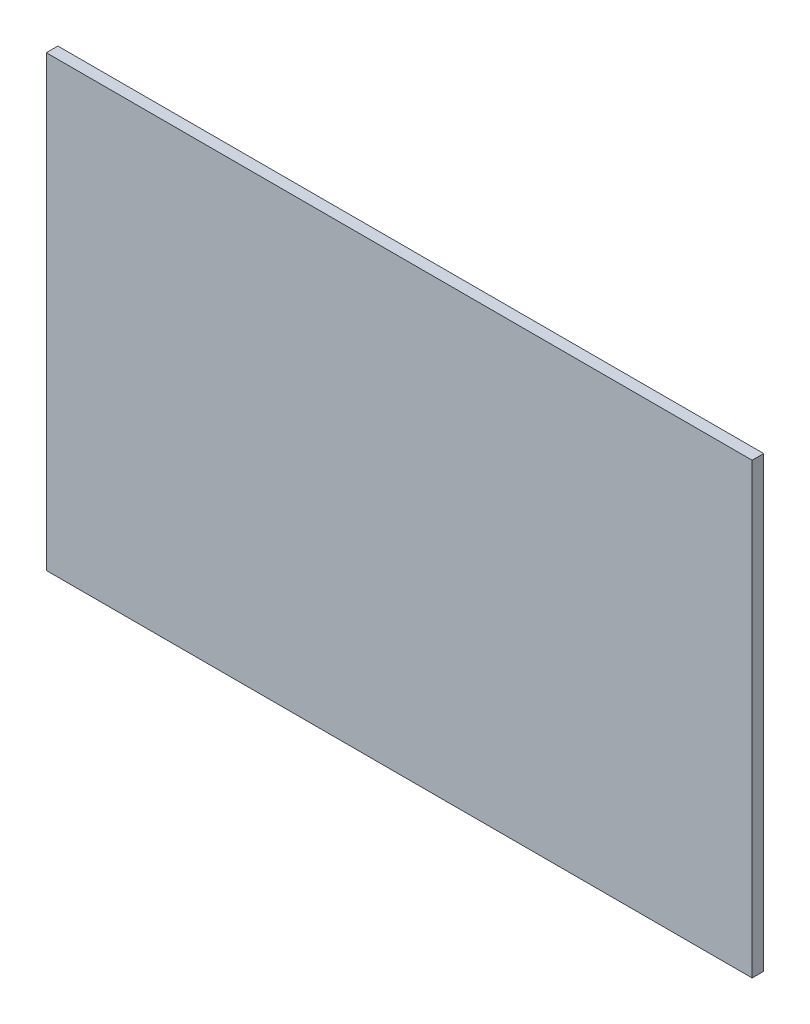
ISO-10303-21;
HEADER;
FILE_DESCRIPTION(('STEP AP214'),'2;1');
FILE_NAME('part.step','',(''),(''),'','','');
FILE_SCHEMA(('AUTOMOTIVE_DESIGN { 1 0 10303 214 1 1 1 1 }'));
ENDSEC;
DATA;
#1=APPLICATION_CONTEXT('core data for automotive mechanical design processes');
#2=APPLICATION_PROTOCOL_DEFINITION('international standard','automotive_design',2000,#1);
#3=PRODUCT_CONTEXT('',#1,'mechanical');
#4=PRODUCT('Part','Part','',(#3));
#5=PRODUCT_RELATED_PRODUCT_CATEGORY('part','',(#4));
#6=PRODUCT_DEFINITION_FORMATION('','',#4);
#7=PRODUCT_DEFINITION_CONTEXT('part definition',#1,'design');
#8=PRODUCT_DEFINITION('design','',#6,#7);
#9=PRODUCT_DEFINITION_SHAPE('','',#8);
#10=(LENGTH_UNIT() NAMED_UNIT(*) SI_UNIT(.MILLI.,.METRE.));
#11=(NAMED_UNIT(*) PLANE_ANGLE_UNIT() SI_UNIT($,.RADIAN.));
#12=(NAMED_UNIT(*) SI_UNIT($,.STERADIAN.) SOLID_ANGLE_UNIT());
#13=UNCERTAINTY_MEASURE_WITH_UNIT(LENGTH_MEASURE(1.E-05),#10,'distance_accuracy_value','');
#14=(GEOMETRIC_REPRESENTATION_CONTEXT(3) GLOBAL_UNCERTAINTY_ASSIGNED_CONTEXT((#13)) GLOBAL_UNIT_ASSIGNED_CONTEXT((#10,
#11,#12)) REPRESENTATION_CONTEXT('',''));
#15=CARTESIAN_POINT('',(0.,0.,0.));
#16=DIRECTION('',(0.,0.,1.));
#17=DIRECTION('',(1.,0.,0.));
#18=AXIS2_PLACEMENT_3D('',#15,#16,#17);
#19=CARTESIAN_POINT('',(0.,0.,40.));
#20=DIRECTION('',(1.,0.,0.));
#21=DIRECTION('',(0.,0.,-1.));
#22=AXIS2_PLACEMENT_3D('',#19,#20,#21);
#23=PLANE('',#22);
#24=DIRECTION('',(0.,-1.,0.));
#25=VECTOR('',#24,1.);
#26=CARTESIAN_POINT('',(0.,0.,0.));
#27=LINE('',#26,#25);
#28=CARTESIAN_POINT('',(0.,1550.,0.));
#29=VERTEX_POINT('',#28);
#30=CARTESIAN_POINT('',(0.,0.,0.));
#31=VERTEX_POINT('',#30);
#32=EDGE_CURVE('E99',#29,#31,#27,.T.);
#33=ORIENTED_EDGE('',*,*,#32,.T.);
#34=DIRECTION('',(0.,0.,-1.));
#35=VECTOR('',#34,1.);
#36=CARTESIAN_POINT('',(0.,0.,40.));
#37=LINE('',#36,#35);
#38=CARTESIAN_POINT('',(0.,0.,40.));
#39=VERTEX_POINT('',#38);
#40=EDGE_CURVE('E11',#39,#31,#37,.T.);
#41=ORIENTED_EDGE('',*,*,#40,.F.);
#42=DIRECTION('',(0.,-1.,0.));
#43=VECTOR('',#42,1.);
#44=CARTESIAN_POINT('',(0.,0.,40.));
#45=LINE('',#44,#43);
#46=CARTESIAN_POINT('',(0.,1550.,40.));
#47=VERTEX_POINT('',#46);
#48=EDGE_CURVE('E87',#47,#39,#45,.T.);
#49=ORIENTED_EDGE('',*,*,#48,.F.);
#50=DIRECTION('',(0.,0.,-1.));
#51=VECTOR('',#50,1.);
#52=CARTESIAN_POINT('',(0.,1550.,40.));
#53=LINE('',#52,#51);
#54=EDGE_CURVE('E95',#47,#29,#53,.T.);
#55=ORIENTED_EDGE('',*,*,#54,.T.);
#56=EDGE_LOOP('',(#33,#41,#49,#55));
#57=FACE_BOUND('',#56,.T.);
#58=ADVANCED_FACE('F36',(#57),#23,.F.);
#59=CARTESIAN_POINT('',(0.,0.,40.));
#60=DIRECTION('',(0.,1.,0.));
#61=DIRECTION('',(0.,0.,1.));
#62=AXIS2_PLACEMENT_3D('',#59,#60,#61);
#63=PLANE('',#62);
#64=DIRECTION('',(1.,0.,0.));
#65=VECTOR('',#64,1.);
#66=CARTESIAN_POINT('',(0.,0.,0.));
#67=LINE('',#66,#65);
#68=CARTESIAN_POINT('',(2440.,0.,0.));
#69=VERTEX_POINT('',#68);
#70=EDGE_CURVE('E91',#31,#69,#67,.T.);
#71=ORIENTED_EDGE('',*,*,#70,.T.);
#72=DIRECTION('',(0.,0.,-1.));
#73=VECTOR('',#72,1.);
#74=CARTESIAN_POINT('',(2440.,0.,40.));
#75=LINE('',#74,#73);
#76=CARTESIAN_POINT('',(2440.,0.,40.));
#77=VERTEX_POINT('',#76);
#78=EDGE_CURVE('E44',#77,#69,#75,.T.);
#79=ORIENTED_EDGE('',*,*,#78,.F.);
#80=DIRECTION('',(1.,0.,0.));
#81=VECTOR('',#80,1.);
#82=CARTESIAN_POINT('',(0.,0.,40.));
#83=LINE('',#82,#81);
#84=EDGE_CURVE('E82',#39,#77,#83,.T.);
#85=ORIENTED_EDGE('',*,*,#84,.F.);
#86=ORIENTED_EDGE('',*,*,#40,.T.);
#87=EDGE_LOOP('',(#71,#79,#85,#86));
#88=FACE_BOUND('',#87,.T.);
#89=ADVANCED_FACE('F90',(#88),#63,.F.);
#90=CARTESIAN_POINT('',(2440.,0.,40.));
#91=DIRECTION('',(-1.,0.,0.));
#92=DIRECTION('',(0.,0.,1.));
#93=AXIS2_PLACEMENT_3D('',#90,#91,#92);
#94=PLANE('',#93);
#95=DIRECTION('',(0.,1.,0.));
#96=VECTOR('',#95,1.);
#97=CARTESIAN_POINT('',(2440.,0.,0.));
#98=LINE('',#97,#96);
#99=CARTESIAN_POINT('',(2440.,1550.,0.));
#100=VERTEX_POINT('',#99);
#101=EDGE_CURVE('E69',#69,#100,#98,.T.);
#102=ORIENTED_EDGE('',*,*,#101,.T.);
#103=DIRECTION('',(0.,0.,-1.));
#104=VECTOR('',#103,1.);
#105=CARTESIAN_POINT('',(2440.,1550.,40.));
#106=LINE('',#105,#104);
#107=CARTESIAN_POINT('',(2440.,1550.,40.));
#108=VERTEX_POINT('',#107);
#109=EDGE_CURVE('E92',#108,#100,#106,.T.);
#110=ORIENTED_EDGE('',*,*,#109,.F.);
#111=DIRECTION('',(0.,1.,0.));
#112=VECTOR('',#111,1.);
#113=CARTESIAN_POINT('',(2440.,0.,40.));
#114=LINE('',#113,#112);
#115=EDGE_CURVE('E85',#77,#108,#114,.T.);
#116=ORIENTED_EDGE('',*,*,#115,.F.);
#117=ORIENTED_EDGE('',*,*,#78,.T.);
#118=EDGE_LOOP('',(#102,#110,#116,#117));
#119=FACE_BOUND('',#118,.T.);
#120=ADVANCED_FACE('F93',(#119),#94,.F.);
#121=CARTESIAN_POINT('',(0.,1550.,40.));
#122=DIRECTION('',(0.,-1.,0.));
#123=DIRECTION('',(0.,0.,-1.));
#124=AXIS2_PLACEMENT_3D('',#121,#122,#123);
#125=PLANE('',#124);
#126=DIRECTION('',(-1.,0.,0.));
#127=VECTOR('',#126,1.);
#128=CARTESIAN_POINT('',(0.,1550.,0.));
#129=LINE('',#128,#127);
#130=EDGE_CURVE('E75',#100,#29,#129,.T.);
#131=ORIENTED_EDGE('',*,*,#130,.T.);
#132=ORIENTED_EDGE('',*,*,#54,.F.);
#133=DIRECTION('',(-1.,0.,0.));
#134=VECTOR('',#133,1.);
#135=CARTESIAN_POINT('',(0.,1550.,40.));
#136=LINE('',#135,#134);
#137=EDGE_CURVE('E52',#108,#47,#136,.T.);
#138=ORIENTED_EDGE('',*,*,#137,.F.);
#139=ORIENTED_EDGE('',*,*,#109,.T.);
#140=EDGE_LOOP('',(#131,#132,#138,#139));
#141=FACE_BOUND('',#140,.T.);
#142=ADVANCED_FACE('F106',(#141),#125,.F.);
#143=CARTESIAN_POINT('',(0.,0.,40.));
#144=DIRECTION('',(0.,0.,-1.));
#145=DIRECTION('',(-1.,0.,0.));
#146=AXIS2_PLACEMENT_3D('',#143,#144,#145);
#147=PLANE('',#146);
#148=ORIENTED_EDGE('',*,*,#48,.T.);
#149=ORIENTED_EDGE('',*,*,#84,.T.);
#150=ORIENTED_EDGE('',*,*,#115,.T.);
#151=ORIENTED_EDGE('',*,*,#137,.T.);
#152=EDGE_LOOP('',(#148,#149,#150,#151));
#153=FACE_BOUND('',#152,.T.);
#154=ADVANCED_FACE('F83',(#153),#147,.F.);
#155=CARTESIAN_POINT('',(0.,0.,0.));
#156=DIRECTION('',(0.,0.,-1.));
#157=DIRECTION('',(-1.,0.,0.));
#158=AXIS2_PLACEMENT_3D('',#155,#156,#157);
#159=PLANE('',#158);
#160=ORIENTED_EDGE('',*,*,#32,.F.);
#161=ORIENTED_EDGE('',*,*,#130,.F.);
#162=ORIENTED_EDGE('',*,*,#101,.F.);
#163=ORIENTED_EDGE('',*,*,#70,.F.);
#164=EDGE_LOOP('',(#160,#161,#162,#163));
#165=FACE_BOUND('',#164,.T.);
#166=ADVANCED_FACE('F109',(#165),#159,.T.);
#167=CLOSED_SHELL('',(#58,#89,#120,#142,#154,#166));
#168=MANIFOLD_SOLID_BREP('B2',#167);
#169=ADVANCED_BREP_SHAPE_REPRESENTATION('',(#18,#168),#14);
#170=SHAPE_DEFINITION_REPRESENTATION(#9,#169);
ENDSEC;
END-ISO-10303-21;
